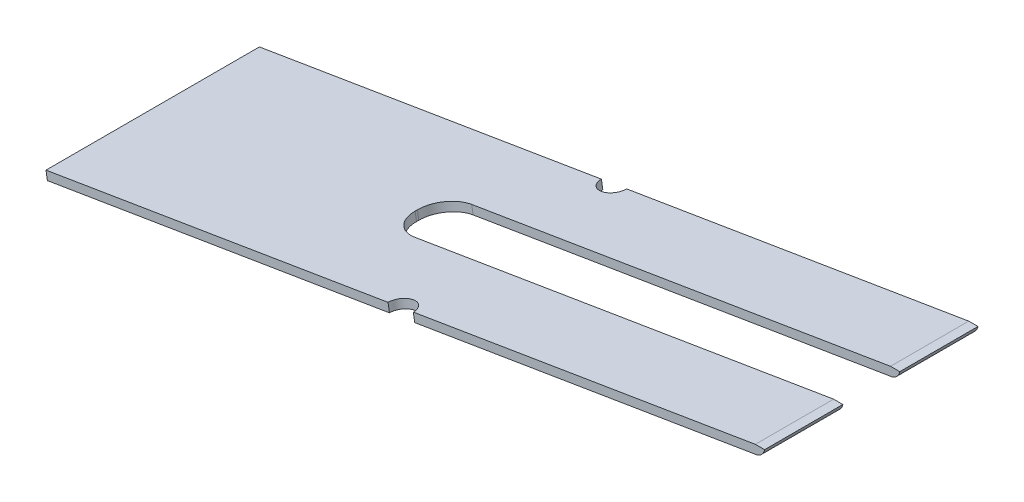
ISO-10303-21;
HEADER;
FILE_DESCRIPTION(('STEP AP214'),'2;1');
FILE_NAME('part.step','',(''),(''),'','','');
FILE_SCHEMA(('AUTOMOTIVE_DESIGN { 1 0 10303 214 1 1 1 1 }'));
ENDSEC;
DATA;
#1=APPLICATION_CONTEXT('core data for automotive mechanical design processes');
#2=APPLICATION_PROTOCOL_DEFINITION('international standard','automotive_design',2000,#1);
#3=PRODUCT_CONTEXT('',#1,'mechanical');
#4=PRODUCT('Part','Part','',(#3));
#5=PRODUCT_RELATED_PRODUCT_CATEGORY('part','',(#4));
#6=PRODUCT_DEFINITION_FORMATION('','',#4);
#7=PRODUCT_DEFINITION_CONTEXT('part definition',#1,'design');
#8=PRODUCT_DEFINITION('design','',#6,#7);
#9=PRODUCT_DEFINITION_SHAPE('','',#8);
#10=(LENGTH_UNIT() NAMED_UNIT(*) SI_UNIT(.MILLI.,.METRE.));
#11=(NAMED_UNIT(*) PLANE_ANGLE_UNIT() SI_UNIT($,.RADIAN.));
#12=(NAMED_UNIT(*) SI_UNIT($,.STERADIAN.) SOLID_ANGLE_UNIT());
#13=UNCERTAINTY_MEASURE_WITH_UNIT(LENGTH_MEASURE(1.E-05),#10,'distance_accuracy_value','');
#14=(GEOMETRIC_REPRESENTATION_CONTEXT(3) GLOBAL_UNCERTAINTY_ASSIGNED_CONTEXT((#13)) GLOBAL_UNIT_ASSIGNED_CONTEXT((#10,
#11,#12)) REPRESENTATION_CONTEXT('',''));
#15=CARTESIAN_POINT('',(0.,0.,0.));
#16=DIRECTION('',(0.,0.,1.));
#17=DIRECTION('',(1.,0.,0.));
#18=AXIS2_PLACEMENT_3D('',#15,#16,#17);
#19=CARTESIAN_POINT('',(4.51066985129935,-15.5118595443418,-1.875));
#20=DIRECTION('',(0.,0.,1.));
#21=DIRECTION('',(1.,0.,0.));
#22=AXIS2_PLACEMENT_3D('',#19,#20,#21);
#23=PLANE('',#22);
#24=DIRECTION('',(-0.986624161512532,-0.163011545357048,0.));
#25=VECTOR('',#24,1.);
#26=CARTESIAN_POINT('',(4.53726121559095,-15.5500625,-1.875));
#27=LINE('',#26,#25);
#28=CARTESIAN_POINT('',(-1.91799124424901,-16.6166091346731,-1.875));
#29=VERTEX_POINT('',#28);
#30=CARTESIAN_POINT('',(-7.92926283140832,-17.6098005739356,-1.875));
#31=VERTEX_POINT('',#30);
#32=EDGE_CURVE('E226',#29,#31,#27,.T.);
#33=ORIENTED_EDGE('',*,*,#32,.F.);
#34=DIRECTION('',(0.163011545357048,-0.986624161512532,0.));
#35=VECTOR('',#34,1.);
#36=CARTESIAN_POINT('',(-1.94244297605256,-16.4686155104463,-1.875));
#37=LINE('',#36,#35);
#38=CARTESIAN_POINT('',(-1.89353951244545,-16.7646027589,-1.875));
#39=VERTEX_POINT('',#38);
#40=EDGE_CURVE('E11',#29,#39,#37,.T.);
#41=ORIENTED_EDGE('',*,*,#40,.T.);
#42=DIRECTION('',(0.986624161512532,0.163011545357048,0.));
#43=VECTOR('',#42,1.);
#44=CARTESIAN_POINT('',(4.56171294739451,-15.6980561242269,-1.875));
#45=LINE('',#44,#43);
#46=CARTESIAN_POINT('',(-7.90481109960476,-17.7577941981625,-1.875));
#47=VERTEX_POINT('',#46);
#48=EDGE_CURVE('E161',#47,#39,#45,.T.);
#49=ORIENTED_EDGE('',*,*,#48,.F.);
#50=DIRECTION('',(0.163011545357045,-0.986624161512533,0.));
#51=VECTOR('',#50,1.);
#52=CARTESIAN_POINT('',(-7.92926283140832,-17.6098005739356,-1.875));
#53=LINE('',#52,#51);
#54=EDGE_CURVE('E168',#31,#47,#53,.T.);
#55=ORIENTED_EDGE('',*,*,#54,.F.);
#56=EDGE_LOOP('',(#33,#41,#49,#55));
#57=FACE_BOUND('',#56,.T.);
#58=ADVANCED_FACE('F35',(#57),#23,.F.);
#59=CARTESIAN_POINT('',(4.51066985129935,-15.5118595443418,1.875));
#60=DIRECTION('',(0.,0.,1.));
#61=DIRECTION('',(1.,0.,0.));
#62=AXIS2_PLACEMENT_3D('',#59,#60,#61);
#63=PLANE('',#62);
#64=DIRECTION('',(0.163011545357048,-0.986624161512532,0.));
#65=VECTOR('',#64,1.);
#66=CARTESIAN_POINT('',(-1.94244297605256,-16.4686155104463,1.875));
#67=LINE('',#66,#65);
#68=CARTESIAN_POINT('',(-1.91799124424901,-16.6166091346731,1.875));
#69=VERTEX_POINT('',#68);
#70=CARTESIAN_POINT('',(-1.89353951244545,-16.7646027589,1.875));
#71=VERTEX_POINT('',#70);
#72=EDGE_CURVE('E152',#69,#71,#67,.T.);
#73=ORIENTED_EDGE('',*,*,#72,.F.);
#74=DIRECTION('',(-0.986624161512532,-0.163011545357048,0.));
#75=VECTOR('',#74,1.);
#76=CARTESIAN_POINT('',(4.53726121559095,-15.5500625,1.875));
#77=LINE('',#76,#75);
#78=CARTESIAN_POINT('',(-7.92926283140832,-17.6098005739356,1.875));
#79=VERTEX_POINT('',#78);
#80=EDGE_CURVE('E402',#69,#79,#77,.T.);
#81=ORIENTED_EDGE('',*,*,#80,.T.);
#82=DIRECTION('',(0.163011545357045,-0.986624161512533,0.));
#83=VECTOR('',#82,1.);
#84=CARTESIAN_POINT('',(-7.92926283140832,-17.6098005739356,1.875));
#85=LINE('',#84,#83);
#86=CARTESIAN_POINT('',(-7.90481109960476,-17.7577941981625,1.875));
#87=VERTEX_POINT('',#86);
#88=EDGE_CURVE('E216',#79,#87,#85,.T.);
#89=ORIENTED_EDGE('',*,*,#88,.T.);
#90=DIRECTION('',(0.986624161512532,0.163011545357048,0.));
#91=VECTOR('',#90,1.);
#92=CARTESIAN_POINT('',(4.56171294739451,-15.6980561242269,1.875));
#93=LINE('',#92,#91);
#94=EDGE_CURVE('E210',#87,#71,#93,.T.);
#95=ORIENTED_EDGE('',*,*,#94,.T.);
#96=EDGE_LOOP('',(#73,#81,#89,#95));
#97=FACE_BOUND('',#96,.T.);
#98=ADVANCED_FACE('F214',(#97),#63,.T.);
#99=CARTESIAN_POINT('',(4.53726121559095,-15.5500625,1.875));
#100=DIRECTION('',(0.,-1.,0.));
#101=DIRECTION('',(0.,0.,-1.));
#102=AXIS2_PLACEMENT_3D('',#99,#100,#101);
#103=PLANE('',#102);
#104=DIRECTION('',(0.,0.,-1.));
#105=VECTOR('',#104,1.);
#106=CARTESIAN_POINT('',(4.53726121559095,-15.5500625,1.875));
#107=LINE('',#106,#105);
#108=CARTESIAN_POINT('',(4.53726121559095,-15.5500625,-0.5));
#109=VERTEX_POINT('',#108);
#110=CARTESIAN_POINT('',(4.53726121559095,-15.5500625,-1.875));
#111=VERTEX_POINT('',#110);
#112=EDGE_CURVE('E189',#109,#111,#107,.T.);
#113=ORIENTED_EDGE('',*,*,#112,.F.);
#114=DIRECTION('',(1.,0.,0.));
#115=VECTOR('',#114,1.);
#116=CARTESIAN_POINT('',(4.53726121559095,-15.5500625,-0.5));
#117=LINE('',#116,#115);
#118=CARTESIAN_POINT('',(4.69991862460804,-15.5500625,-0.5));
#119=VERTEX_POINT('',#118);
#120=EDGE_CURVE('E383',#109,#119,#117,.T.);
#121=ORIENTED_EDGE('',*,*,#120,.T.);
#122=DIRECTION('',(0.,0.,-1.));
#123=VECTOR('',#122,1.);
#124=CARTESIAN_POINT('',(4.69991862460804,-15.5500625,1.875));
#125=LINE('',#124,#123);
#126=CARTESIAN_POINT('',(4.69991862460804,-15.5500625,-1.875));
#127=VERTEX_POINT('',#126);
#128=EDGE_CURVE('E180',#119,#127,#125,.T.);
#129=ORIENTED_EDGE('',*,*,#128,.T.);
#130=DIRECTION('',(-1.,0.,0.));
#131=VECTOR('',#130,1.);
#132=CARTESIAN_POINT('',(4.53726121559095,-15.5500625,-1.875));
#133=LINE('',#132,#131);
#134=EDGE_CURVE('E224',#127,#111,#133,.T.);
#135=ORIENTED_EDGE('',*,*,#134,.T.);
#136=EDGE_LOOP('',(#113,#121,#129,#135));
#137=FACE_BOUND('',#136,.T.);
#138=ADVANCED_FACE('F241',(#137),#103,.F.);
#139=CARTESIAN_POINT('',(4.51066985129935,-15.5118595443418,1.875));
#140=DIRECTION('',(0.,0.,-1.));
#141=DIRECTION('',(-1.,0.,0.));
#142=AXIS2_PLACEMENT_3D('',#139,#140,#141);
#143=CYLINDRICAL_SURFACE('',#142,0.193066216671547);
#144=ORIENTED_EDGE('',*,*,#128,.F.);
#145=CARTESIAN_POINT('',(4.51066985129935,-15.5118595443418,-0.5));
#146=DIRECTION('',(0.,0.,-1.));
#147=DIRECTION('',(-1.,0.,0.));
#148=AXIS2_PLACEMENT_3D('',#145,#146,#147);
#149=CIRCLE('',#148,0.193066216671547);
#150=CARTESIAN_POINT('',(4.5617129473945,-15.6980561242269,-0.5));
#151=VERTEX_POINT('',#150);
#152=EDGE_CURVE('E196',#119,#151,#149,.T.);
#153=ORIENTED_EDGE('',*,*,#152,.T.);
#154=DIRECTION('',(0.,0.,-1.));
#155=VECTOR('',#154,1.);
#156=CARTESIAN_POINT('',(4.56171294739451,-15.6980561242269,1.875));
#157=LINE('',#156,#155);
#158=CARTESIAN_POINT('',(4.56171294739451,-15.6980561242269,-1.875));
#159=VERTEX_POINT('',#158);
#160=EDGE_CURVE('E179',#151,#159,#157,.T.);
#161=ORIENTED_EDGE('',*,*,#160,.T.);
#162=CARTESIAN_POINT('',(4.51066985129935,-15.5118595443418,-1.875));
#163=DIRECTION('',(0.,0.,1.));
#164=DIRECTION('',(1.,0.,0.));
#165=AXIS2_PLACEMENT_3D('',#162,#163,#164);
#166=CIRCLE('',#165,0.193066216671547);
#167=EDGE_CURVE('E167',#159,#127,#166,.T.);
#168=ORIENTED_EDGE('',*,*,#167,.T.);
#169=EDGE_LOOP('',(#144,#153,#161,#168));
#170=FACE_BOUND('',#169,.T.);
#171=ADVANCED_FACE('F260',(#170),#143,.T.);
#172=CARTESIAN_POINT('',(4.69991862460804,-15.5500625,1.875));
#173=VERTEX_POINT('',#172);
#174=CARTESIAN_POINT('',(4.69991862460804,-15.5500625,0.5));
#175=VERTEX_POINT('',#174);
#176=EDGE_CURVE('E176',#173,#175,#125,.T.);
#177=ORIENTED_EDGE('',*,*,#176,.T.);
#178=DIRECTION('',(-1.,0.,0.));
#179=VECTOR('',#178,1.);
#180=CARTESIAN_POINT('',(4.53726121559095,-15.5500625,0.5));
#181=LINE('',#180,#179);
#182=CARTESIAN_POINT('',(4.53726121559095,-15.5500625,0.5));
#183=VERTEX_POINT('',#182);
#184=EDGE_CURVE('E425',#175,#183,#181,.T.);
#185=ORIENTED_EDGE('',*,*,#184,.T.);
#186=CARTESIAN_POINT('',(4.53726121559095,-15.5500625,1.875));
#187=VERTEX_POINT('',#186);
#188=EDGE_CURVE('E190',#187,#183,#107,.T.);
#189=ORIENTED_EDGE('',*,*,#188,.F.);
#190=DIRECTION('',(-1.,0.,0.));
#191=VECTOR('',#190,1.);
#192=CARTESIAN_POINT('',(4.53726121559095,-15.5500625,1.875));
#193=LINE('',#192,#191);
#194=EDGE_CURVE('E175',#173,#187,#193,.T.);
#195=ORIENTED_EDGE('',*,*,#194,.F.);
#196=EDGE_LOOP('',(#177,#185,#189,#195));
#197=FACE_BOUND('',#196,.T.);
#198=ADVANCED_FACE('F37',(#197),#103,.F.);
#199=CARTESIAN_POINT('',(4.53726121559095,-15.5500625,1.875));
#200=DIRECTION('',(0.163011545357048,-0.986624161512532,0.));
#201=DIRECTION('',(0.986624161512532,0.163011545357048,0.));
#202=AXIS2_PLACEMENT_3D('',#199,#200,#201);
#203=PLANE('',#202);
#204=CARTESIAN_POINT('',(-1.47401037156837,-16.5432539392625,-1.875));
#205=VERTEX_POINT('',#204);
#206=EDGE_CURVE('E170',#111,#205,#27,.T.);
#207=ORIENTED_EDGE('',*,*,#206,.T.);
#208=CARTESIAN_POINT('',(-1.69600080790869,-16.5799315369678,-1.875));
#209=DIRECTION('',(0.163011545357048,-0.986624161512532,0.));
#210=DIRECTION('',(0.986624161512532,0.163011545357048,0.));
#211=AXIS2_PLACEMENT_3D('',#208,#209,#210);
#212=CIRCLE('',#211,0.225000000000001);
#213=EDGE_CURVE('E50',#205,#29,#212,.T.);
#214=ORIENTED_EDGE('',*,*,#213,.T.);
#215=ORIENTED_EDGE('',*,*,#32,.T.);
#216=DIRECTION('',(0.,0.,-1.));
#217=VECTOR('',#216,1.);
#218=CARTESIAN_POINT('',(-7.92926283140832,-17.6098005739356,1.875));
#219=LINE('',#218,#217);
#220=EDGE_CURVE('E186',#79,#31,#219,.T.);
#221=ORIENTED_EDGE('',*,*,#220,.F.);
#222=ORIENTED_EDGE('',*,*,#80,.F.);
#223=CARTESIAN_POINT('',(-1.69600080790869,-16.5799315369678,1.875));
#224=DIRECTION('',(0.163011545357048,-0.986624161512532,0.));
#225=DIRECTION('',(0.986624161512532,0.163011545357048,0.));
#226=AXIS2_PLACEMENT_3D('',#223,#224,#225);
#227=CIRCLE('',#226,0.225000000000001);
#228=CARTESIAN_POINT('',(-1.47401037156837,-16.5432539392625,1.875));
#229=VERTEX_POINT('',#228);
#230=EDGE_CURVE('E204',#69,#229,#227,.T.);
#231=ORIENTED_EDGE('',*,*,#230,.T.);
#232=EDGE_CURVE('E403',#187,#229,#77,.T.);
#233=ORIENTED_EDGE('',*,*,#232,.F.);
#234=ORIENTED_EDGE('',*,*,#188,.T.);
#235=DIRECTION('',(-0.986624161512532,-0.163011545357048,0.));
#236=VECTOR('',#235,1.);
#237=CARTESIAN_POINT('',(4.53726121559095,-15.5500625,0.5));
#238=LINE('',#237,#236);
#239=CARTESIAN_POINT('',(-2.82295502929254,-16.7661286283636,0.499999999999999));
#240=VERTEX_POINT('',#239);
#241=EDGE_CURVE('E395',#183,#240,#238,.T.);
#242=ORIENTED_EDGE('',*,*,#241,.T.);
#243=CARTESIAN_POINT('',(-2.82295502929254,-16.7661286283636,0.0199999999999992));
#244=DIRECTION('',(0.163011545357048,-0.986624161512532,0.));
#245=DIRECTION('',(0.986624161512532,0.163011545357048,0.));
#246=AXIS2_PLACEMENT_3D('',#243,#244,#245);
#247=CIRCLE('',#246,0.48);
#248=CARTESIAN_POINT('',(-3.29653462681855,-16.844374170135,0.0199999999999992));
#249=VERTEX_POINT('',#248);
#250=EDGE_CURVE('E390',#240,#249,#247,.T.);
#251=ORIENTED_EDGE('',*,*,#250,.T.);
#252=DIRECTION('',(0.,0.,-1.));
#253=VECTOR('',#252,1.);
#254=CARTESIAN_POINT('',(-3.29653462681855,-16.844374170135,1.875));
#255=LINE('',#254,#253);
#256=CARTESIAN_POINT('',(-3.29653462681855,-16.844374170135,-0.0200000000000008));
#257=VERTEX_POINT('',#256);
#258=EDGE_CURVE('E393',#249,#257,#255,.T.);
#259=ORIENTED_EDGE('',*,*,#258,.T.);
#260=CARTESIAN_POINT('',(-2.82295502929254,-16.7661286283636,-0.0200000000000009));
#261=DIRECTION('',(0.163011545357048,-0.986624161512532,0.));
#262=DIRECTION('',(0.986624161512532,0.163011545357048,0.));
#263=AXIS2_PLACEMENT_3D('',#260,#261,#262);
#264=CIRCLE('',#263,0.479999999999999);
#265=CARTESIAN_POINT('',(-2.82295502929254,-16.7661286283636,-0.500000000000001));
#266=VERTEX_POINT('',#265);
#267=EDGE_CURVE('E227',#257,#266,#264,.T.);
#268=ORIENTED_EDGE('',*,*,#267,.T.);
#269=DIRECTION('',(0.986624161512532,0.163011545357048,0.));
#270=VECTOR('',#269,1.);
#271=CARTESIAN_POINT('',(4.53726121559095,-15.5500625,-0.5));
#272=LINE('',#271,#270);
#273=EDGE_CURVE('E387',#266,#109,#272,.T.);
#274=ORIENTED_EDGE('',*,*,#273,.T.);
#275=ORIENTED_EDGE('',*,*,#112,.T.);
#276=EDGE_LOOP('',(#207,#214,#215,#221,#222,#231,#233,#234,#242,#251,#259,#268,#274,#275));
#277=FACE_BOUND('',#276,.T.);
#278=ADVANCED_FACE('F231',(#277),#203,.F.);
#279=CARTESIAN_POINT('',(-7.92926283140832,-17.6098005739356,1.875));
#280=DIRECTION('',(0.986624161512533,0.163011545357045,0.));
#281=DIRECTION('',(-0.163011545357045,0.986624161512533,0.));
#282=AXIS2_PLACEMENT_3D('',#279,#280,#281);
#283=PLANE('',#282);
#284=ORIENTED_EDGE('',*,*,#54,.T.);
#285=DIRECTION('',(0.,0.,-1.));
#286=VECTOR('',#285,1.);
#287=CARTESIAN_POINT('',(-7.90481109960476,-17.7577941981625,1.875));
#288=LINE('',#287,#286);
#289=EDGE_CURVE('E184',#87,#47,#288,.T.);
#290=ORIENTED_EDGE('',*,*,#289,.F.);
#291=ORIENTED_EDGE('',*,*,#88,.F.);
#292=ORIENTED_EDGE('',*,*,#220,.T.);
#293=EDGE_LOOP('',(#284,#290,#291,#292));
#294=FACE_BOUND('',#293,.T.);
#295=ADVANCED_FACE('F235',(#294),#283,.F.);
#296=CARTESIAN_POINT('',(4.56171294739451,-15.6980561242269,1.875));
#297=DIRECTION('',(-0.163011545357048,0.986624161512532,0.));
#298=DIRECTION('',(-0.986624161512532,-0.163011545357048,0.));
#299=AXIS2_PLACEMENT_3D('',#296,#297,#298);
#300=PLANE('',#299);
#301=ORIENTED_EDGE('',*,*,#48,.T.);
#302=CARTESIAN_POINT('',(-1.67154907610513,-16.7279251611947,-1.875));
#303=DIRECTION('',(0.163011545357048,-0.986624161512532,0.));
#304=DIRECTION('',(0.986624161512532,0.163011545357048,0.));
#305=AXIS2_PLACEMENT_3D('',#302,#303,#304);
#306=CIRCLE('',#305,0.225000000000001);
#307=CARTESIAN_POINT('',(-1.44955863976481,-16.6912475634893,-1.875));
#308=VERTEX_POINT('',#307);
#309=EDGE_CURVE('E147',#308,#39,#306,.T.);
#310=ORIENTED_EDGE('',*,*,#309,.F.);
#311=EDGE_CURVE('E157',#308,#159,#45,.T.);
#312=ORIENTED_EDGE('',*,*,#311,.T.);
#313=ORIENTED_EDGE('',*,*,#160,.F.);
#314=DIRECTION('',(0.986624161512532,0.163011545357048,0.));
#315=VECTOR('',#314,1.);
#316=CARTESIAN_POINT('',(12.395508789804,-14.4037444540919,-0.499999999999999));
#317=LINE('',#316,#315);
#318=CARTESIAN_POINT('',(-2.79850329748898,-16.9141222525905,-0.500000000000001));
#319=VERTEX_POINT('',#318);
#320=EDGE_CURVE('E420',#319,#151,#317,.T.);
#321=ORIENTED_EDGE('',*,*,#320,.F.);
#322=CARTESIAN_POINT('',(-2.79850329748898,-16.9141222525905,-0.0200000000000009));
#323=DIRECTION('',(0.163011545357048,-0.986624161512532,0.));
#324=DIRECTION('',(0.986624161512532,0.163011545357048,0.));
#325=AXIS2_PLACEMENT_3D('',#322,#323,#324);
#326=CIRCLE('',#325,0.479999999999999);
#327=CARTESIAN_POINT('',(-3.272082895015,-16.9923677943618,-0.0200000000000008));
#328=VERTEX_POINT('',#327);
#329=EDGE_CURVE('E417',#328,#319,#326,.T.);
#330=ORIENTED_EDGE('',*,*,#329,.F.);
#331=DIRECTION('',(0.,0.,-1.));
#332=VECTOR('',#331,1.);
#333=CARTESIAN_POINT('',(-3.272082895015,-16.9923677943618,-0.0200000000000009));
#334=LINE('',#333,#332);
#335=CARTESIAN_POINT('',(-3.272082895015,-16.9923677943618,0.0199999999999992));
#336=VERTEX_POINT('',#335);
#337=EDGE_CURVE('E414',#336,#328,#334,.T.);
#338=ORIENTED_EDGE('',*,*,#337,.F.);
#339=CARTESIAN_POINT('',(-2.79850329748898,-16.9141222525905,0.0199999999999992));
#340=DIRECTION('',(0.163011545357048,-0.986624161512532,0.));
#341=DIRECTION('',(-0.986624161512532,-0.163011545357048,0.));
#342=AXIS2_PLACEMENT_3D('',#339,#340,#341);
#343=CIRCLE('',#342,0.48);
#344=CARTESIAN_POINT('',(-2.79850329748898,-16.9141222525905,0.5));
#345=VERTEX_POINT('',#344);
#346=EDGE_CURVE('E408',#345,#336,#343,.T.);
#347=ORIENTED_EDGE('',*,*,#346,.F.);
#348=DIRECTION('',(-0.986624161512532,-0.163011545357048,0.));
#349=VECTOR('',#348,1.);
#350=CARTESIAN_POINT('',(12.395508789804,-14.4037444540919,0.500000000000001));
#351=LINE('',#350,#349);
#352=CARTESIAN_POINT('',(4.5617129473945,-15.6980561242269,0.5));
#353=VERTEX_POINT('',#352);
#354=EDGE_CURVE('E405',#353,#345,#351,.T.);
#355=ORIENTED_EDGE('',*,*,#354,.F.);
#356=CARTESIAN_POINT('',(4.56171294739451,-15.6980561242269,1.875));
#357=VERTEX_POINT('',#356);
#358=EDGE_CURVE('E181',#357,#353,#157,.T.);
#359=ORIENTED_EDGE('',*,*,#358,.F.);
#360=CARTESIAN_POINT('',(-1.44955863976481,-16.6912475634893,1.875));
#361=VERTEX_POINT('',#360);
#362=EDGE_CURVE('E212',#361,#357,#93,.T.);
#363=ORIENTED_EDGE('',*,*,#362,.F.);
#364=CARTESIAN_POINT('',(-1.67154907610513,-16.7279251611947,1.875));
#365=DIRECTION('',(0.163011545357048,-0.986624161512532,0.));
#366=DIRECTION('',(0.986624161512532,0.163011545357048,0.));
#367=AXIS2_PLACEMENT_3D('',#364,#365,#366);
#368=CIRCLE('',#367,0.225000000000001);
#369=EDGE_CURVE('E58',#71,#361,#368,.T.);
#370=ORIENTED_EDGE('',*,*,#369,.F.);
#371=ORIENTED_EDGE('',*,*,#94,.F.);
#372=ORIENTED_EDGE('',*,*,#289,.T.);
#373=EDGE_LOOP('',(#301,#310,#312,#313,#321,#330,#338,#347,#355,#359,#363,#370,#371,#372));
#374=FACE_BOUND('',#373,.T.);
#375=ADVANCED_FACE('F155',(#374),#300,.F.);
#376=ORIENTED_EDGE('',*,*,#358,.T.);
#377=CARTESIAN_POINT('',(4.51066985129935,-15.5118595443418,0.5));
#378=DIRECTION('',(0.,0.,1.));
#379=DIRECTION('',(1.,0.,0.));
#380=AXIS2_PLACEMENT_3D('',#377,#378,#379);
#381=CIRCLE('',#380,0.193066216671547);
#382=EDGE_CURVE('E193',#353,#175,#381,.T.);
#383=ORIENTED_EDGE('',*,*,#382,.T.);
#384=ORIENTED_EDGE('',*,*,#176,.F.);
#385=CARTESIAN_POINT('',(4.51066985129935,-15.5118595443418,1.875));
#386=DIRECTION('',(0.,0.,1.));
#387=DIRECTION('',(1.,0.,0.));
#388=AXIS2_PLACEMENT_3D('',#385,#386,#387);
#389=CIRCLE('',#388,0.193066216671547);
#390=EDGE_CURVE('E218',#357,#173,#389,.T.);
#391=ORIENTED_EDGE('',*,*,#390,.F.);
#392=EDGE_LOOP('',(#376,#383,#384,#391));
#393=FACE_BOUND('',#392,.T.);
#394=ADVANCED_FACE('F254',(#393),#143,.T.);
#395=DIRECTION('',(0.163011545357048,-0.986624161512532,0.));
#396=VECTOR('',#395,1.);
#397=CARTESIAN_POINT('',(-1.49846210337192,-16.3952603150356,1.875));
#398=LINE('',#397,#396);
#399=EDGE_CURVE('E199',#361,#229,#398,.F.);
#400=ORIENTED_EDGE('',*,*,#399,.F.);
#401=ORIENTED_EDGE('',*,*,#362,.T.);
#402=ORIENTED_EDGE('',*,*,#390,.T.);
#403=ORIENTED_EDGE('',*,*,#194,.T.);
#404=ORIENTED_EDGE('',*,*,#232,.T.);
#405=EDGE_LOOP('',(#400,#401,#402,#403,#404));
#406=FACE_BOUND('',#405,.T.);
#407=ADVANCED_FACE('F243',(#406),#63,.T.);
#408=ORIENTED_EDGE('',*,*,#311,.F.);
#409=DIRECTION('',(0.163011545357048,-0.986624161512532,0.));
#410=VECTOR('',#409,1.);
#411=CARTESIAN_POINT('',(-1.49846210337192,-16.3952603150356,-1.875));
#412=LINE('',#411,#410);
#413=EDGE_CURVE('E43',#308,#205,#412,.F.);
#414=ORIENTED_EDGE('',*,*,#413,.T.);
#415=ORIENTED_EDGE('',*,*,#206,.F.);
#416=ORIENTED_EDGE('',*,*,#134,.F.);
#417=ORIENTED_EDGE('',*,*,#167,.F.);
#418=EDGE_LOOP('',(#408,#414,#415,#416,#417));
#419=FACE_BOUND('',#418,.T.);
#420=ADVANCED_FACE('F164',(#419),#23,.F.);
#421=CARTESIAN_POINT('',(-2.8474067610961,-16.6181350041367,-0.0200000000000009));
#422=DIRECTION('',(0.163011545357048,-0.986624161512532,0.));
#423=DIRECTION('',(0.986624161512532,0.163011545357048,0.));
#424=AXIS2_PLACEMENT_3D('',#421,#422,#423);
#425=CYLINDRICAL_SURFACE('',#424,0.479999999999999);
#426=DIRECTION('',(0.163011545357048,-0.986624161512532,0.));
#427=VECTOR('',#426,1.);
#428=CARTESIAN_POINT('',(-3.32098635862211,-16.6963805459081,-0.0200000000000008));
#429=LINE('',#428,#427);
#430=EDGE_CURVE('E426',#257,#328,#429,.T.);
#431=ORIENTED_EDGE('',*,*,#430,.T.);
#432=ORIENTED_EDGE('',*,*,#329,.T.);
#433=DIRECTION('',(0.163011545357048,-0.986624161512532,0.));
#434=VECTOR('',#433,1.);
#435=CARTESIAN_POINT('',(-2.8474067610961,-16.6181350041367,-0.500000000000001));
#436=LINE('',#435,#434);
#437=EDGE_CURVE('E423',#266,#319,#436,.T.);
#438=ORIENTED_EDGE('',*,*,#437,.F.);
#439=ORIENTED_EDGE('',*,*,#267,.F.);
#440=EDGE_LOOP('',(#431,#432,#438,#439));
#441=FACE_BOUND('',#440,.T.);
#442=ADVANCED_FACE('F246',(#441),#425,.F.);
#443=CARTESIAN_POINT('',(-3.32098635862211,-16.6963805459081,-0.0200000000000009));
#444=DIRECTION('',(-0.986624161512532,-0.163011545357048,0.));
#445=DIRECTION('',(0.163011545357048,-0.986624161512532,0.));
#446=AXIS2_PLACEMENT_3D('',#443,#444,#445);
#447=PLANE('',#446);
#448=DIRECTION('',(0.163011545357048,-0.986624161512532,0.));
#449=VECTOR('',#448,1.);
#450=CARTESIAN_POINT('',(-3.32098635862211,-16.6963805459081,0.0199999999999992));
#451=LINE('',#450,#449);
#452=EDGE_CURVE('E428',#249,#336,#451,.T.);
#453=ORIENTED_EDGE('',*,*,#452,.T.);
#454=ORIENTED_EDGE('',*,*,#337,.T.);
#455=ORIENTED_EDGE('',*,*,#430,.F.);
#456=ORIENTED_EDGE('',*,*,#258,.F.);
#457=EDGE_LOOP('',(#453,#454,#455,#456));
#458=FACE_BOUND('',#457,.T.);
#459=ADVANCED_FACE('F251',(#458),#447,.F.);
#460=CARTESIAN_POINT('',(-2.8474067610961,-16.6181350041367,0.0199999999999992));
#461=DIRECTION('',(0.163011545357048,-0.986624161512532,0.));
#462=DIRECTION('',(0.986624161512532,0.163011545357048,0.));
#463=AXIS2_PLACEMENT_3D('',#460,#461,#462);
#464=CYLINDRICAL_SURFACE('',#463,0.48);
#465=DIRECTION('',(0.163011545357048,-0.986624161512532,0.));
#466=VECTOR('',#465,1.);
#467=CARTESIAN_POINT('',(-2.8474067610961,-16.6181350041367,0.5));
#468=LINE('',#467,#466);
#469=EDGE_CURVE('E422',#240,#345,#468,.T.);
#470=ORIENTED_EDGE('',*,*,#469,.T.);
#471=ORIENTED_EDGE('',*,*,#346,.T.);
#472=ORIENTED_EDGE('',*,*,#452,.F.);
#473=ORIENTED_EDGE('',*,*,#250,.F.);
#474=EDGE_LOOP('',(#470,#471,#472,#473));
#475=FACE_BOUND('',#474,.T.);
#476=ADVANCED_FACE('F267',(#475),#464,.F.);
#477=CARTESIAN_POINT('',(12.3466053261969,-14.1077572056382,-0.499999999999999));
#478=DIRECTION('',(0.,0.,-1.));
#479=DIRECTION('',(-1.,0.,0.));
#480=AXIS2_PLACEMENT_3D('',#477,#478,#479);
#481=PLANE('',#480);
#482=ORIENTED_EDGE('',*,*,#437,.T.);
#483=ORIENTED_EDGE('',*,*,#320,.T.);
#484=ORIENTED_EDGE('',*,*,#152,.F.);
#485=ORIENTED_EDGE('',*,*,#120,.F.);
#486=ORIENTED_EDGE('',*,*,#273,.F.);
#487=EDGE_LOOP('',(#482,#483,#484,#485,#486));
#488=FACE_BOUND('',#487,.T.);
#489=ADVANCED_FACE('F265',(#488),#481,.F.);
#490=CARTESIAN_POINT('',(12.3466053261969,-14.1077572056382,0.500000000000001));
#491=DIRECTION('',(0.,0.,1.));
#492=DIRECTION('',(1.,0.,0.));
#493=AXIS2_PLACEMENT_3D('',#490,#491,#492);
#494=PLANE('',#493);
#495=ORIENTED_EDGE('',*,*,#184,.F.);
#496=ORIENTED_EDGE('',*,*,#382,.F.);
#497=ORIENTED_EDGE('',*,*,#354,.T.);
#498=ORIENTED_EDGE('',*,*,#469,.F.);
#499=ORIENTED_EDGE('',*,*,#241,.F.);
#500=EDGE_LOOP('',(#495,#496,#497,#498,#499));
#501=FACE_BOUND('',#500,.T.);
#502=ADVANCED_FACE('F262',(#501),#494,.F.);
#503=CARTESIAN_POINT('',(-1.72045253971224,-16.4319379127409,1.875));
#504=DIRECTION('',(0.163011545357048,-0.986624161512532,0.));
#505=DIRECTION('',(0.986624161512532,0.163011545357048,0.));
#506=AXIS2_PLACEMENT_3D('',#503,#504,#505);
#507=CYLINDRICAL_SURFACE('',#506,0.225000000000001);
#508=ORIENTED_EDGE('',*,*,#72,.T.);
#509=ORIENTED_EDGE('',*,*,#369,.T.);
#510=ORIENTED_EDGE('',*,*,#399,.T.);
#511=ORIENTED_EDGE('',*,*,#230,.F.);
#512=EDGE_LOOP('',(#508,#509,#510,#511));
#513=FACE_BOUND('',#512,.T.);
#514=ADVANCED_FACE('F202',(#513),#507,.F.);
#515=CARTESIAN_POINT('',(-1.72045253971224,-16.4319379127409,-1.875));
#516=DIRECTION('',(0.163011545357048,-0.986624161512532,0.));
#517=DIRECTION('',(0.986624161512532,0.163011545357048,0.));
#518=AXIS2_PLACEMENT_3D('',#515,#516,#517);
#519=CYLINDRICAL_SURFACE('',#518,0.225000000000001);
#520=ORIENTED_EDGE('',*,*,#213,.F.);
#521=ORIENTED_EDGE('',*,*,#413,.F.);
#522=ORIENTED_EDGE('',*,*,#309,.T.);
#523=ORIENTED_EDGE('',*,*,#40,.F.);
#524=EDGE_LOOP('',(#520,#521,#522,#523));
#525=FACE_BOUND('',#524,.T.);
#526=ADVANCED_FACE('F146',(#525),#519,.F.);
#527=CLOSED_SHELL('',(#58,#98,#138,#171,#198,#278,#295,#375,#394,#407,#420,#442,#459,#476,#489,
#502,#514,#526));
#528=MANIFOLD_SOLID_BREP('B2',#527);
#529=ADVANCED_BREP_SHAPE_REPRESENTATION('',(#18,#528),#14);
#530=SHAPE_DEFINITION_REPRESENTATION(#9,#529);
ENDSEC;
END-ISO-10303-21;
